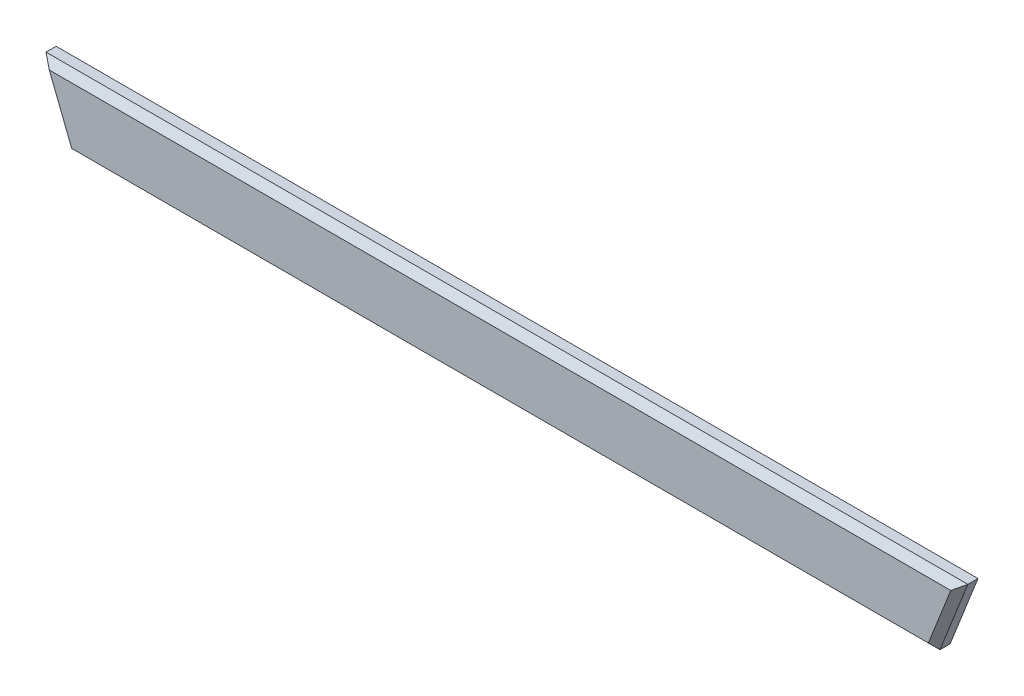
ISO-10303-21;
HEADER;
FILE_DESCRIPTION(('STEP AP214'),'2;1');
FILE_NAME('part.step','',(''),(''),'','','');
FILE_SCHEMA(('AUTOMOTIVE_DESIGN { 1 0 10303 214 1 1 1 1 }'));
ENDSEC;
DATA;
#1=APPLICATION_CONTEXT('core data for automotive mechanical design processes');
#2=APPLICATION_PROTOCOL_DEFINITION('international standard','automotive_design',2000,#1);
#3=PRODUCT_CONTEXT('',#1,'mechanical');
#4=PRODUCT('Part','Part','',(#3));
#5=PRODUCT_RELATED_PRODUCT_CATEGORY('part','',(#4));
#6=PRODUCT_DEFINITION_FORMATION('','',#4);
#7=PRODUCT_DEFINITION_CONTEXT('part definition',#1,'design');
#8=PRODUCT_DEFINITION('design','',#6,#7);
#9=PRODUCT_DEFINITION_SHAPE('','',#8);
#10=(LENGTH_UNIT() NAMED_UNIT(*) SI_UNIT(.MILLI.,.METRE.));
#11=(NAMED_UNIT(*) PLANE_ANGLE_UNIT() SI_UNIT($,.RADIAN.));
#12=(NAMED_UNIT(*) SI_UNIT($,.STERADIAN.) SOLID_ANGLE_UNIT());
#13=UNCERTAINTY_MEASURE_WITH_UNIT(LENGTH_MEASURE(1.E-05),#10,'distance_accuracy_value','');
#14=(GEOMETRIC_REPRESENTATION_CONTEXT(3) GLOBAL_UNCERTAINTY_ASSIGNED_CONTEXT((#13)) GLOBAL_UNIT_ASSIGNED_CONTEXT((#10,
#11,#12)) REPRESENTATION_CONTEXT('',''));
#15=CARTESIAN_POINT('',(0.,0.,0.));
#16=DIRECTION('',(0.,0.,1.));
#17=DIRECTION('',(1.,0.,0.));
#18=AXIS2_PLACEMENT_3D('',#15,#16,#17);
#19=CARTESIAN_POINT('',(0.,0.,0.));
#20=DIRECTION('',(0.,0.,-1.));
#21=DIRECTION('',(-1.,0.,0.));
#22=AXIS2_PLACEMENT_3D('',#19,#20,#21);
#23=PLANE('',#22);
#24=CARTESIAN_POINT('',(-0.259574213234581,1.00607340425443,0.));
#25=DIRECTION('',(0.,0.,-1.));
#26=DIRECTION('',(-1.,0.,0.));
#27=AXIS2_PLACEMENT_3D('',#24,#25,#26);
#28=CIRCLE('',#27,3.);
#29=CARTESIAN_POINT('',(-3.25957421323458,1.00607340425443,0.));
#30=VERTEX_POINT('',#29);
#31=EDGE_CURVE('E192',#30,#30,#28,.T.);
#32=ORIENTED_EDGE('',*,*,#31,.F.);
#33=EDGE_LOOP('',(#32));
#34=FACE_BOUND('',#33,.T.);
#35=DIRECTION('',(0.367438410264357,-0.930047856114083,0.));
#36=VECTOR('',#35,1.);
#37=CARTESIAN_POINT('',(-100.,7.89372984240581,0.));
#38=LINE('',#37,#36);
#39=CARTESIAN_POINT('',(-100.,7.89372984240581,0.));
#40=VERTEX_POINT('',#39);
#41=CARTESIAN_POINT('',(-93.9514058075983,-7.41627015759419,0.));
#42=VERTEX_POINT('',#41);
#43=EDGE_CURVE('E89',#40,#42,#38,.T.);
#44=ORIENTED_EDGE('',*,*,#43,.F.);
#45=DIRECTION('',(-1.,0.,0.));
#46=VECTOR('',#45,1.);
#47=CARTESIAN_POINT('',(100.,7.89372984240583,0.));
#48=LINE('',#47,#46);
#49=CARTESIAN_POINT('',(100.,7.89372984240583,0.));
#50=VERTEX_POINT('',#49);
#51=EDGE_CURVE('E94',#50,#40,#48,.T.);
#52=ORIENTED_EDGE('',*,*,#51,.F.);
#53=DIRECTION('',(0.367438410264355,0.930047856114084,0.));
#54=VECTOR('',#53,1.);
#55=CARTESIAN_POINT('',(100.,7.89372984240583,0.));
#56=LINE('',#55,#54);
#57=CARTESIAN_POINT('',(93.9514058075983,-7.41627015759417,0.));
#58=VERTEX_POINT('',#57);
#59=EDGE_CURVE('E115',#58,#50,#56,.T.);
#60=ORIENTED_EDGE('',*,*,#59,.F.);
#61=DIRECTION('',(1.,0.,0.));
#62=VECTOR('',#61,1.);
#63=CARTESIAN_POINT('',(93.9514058075983,-7.41627015759417,0.));
#64=LINE('',#63,#62);
#65=EDGE_CURVE('E106',#42,#58,#64,.T.);
#66=ORIENTED_EDGE('',*,*,#65,.F.);
#67=EDGE_LOOP('',(#44,#52,#60,#66));
#68=FACE_BOUND('',#67,.T.);
#69=CARTESIAN_POINT('',(69.7404257867654,1.00607340425443,0.));
#70=DIRECTION('',(0.,0.,-1.));
#71=DIRECTION('',(-1.,0.,0.));
#72=AXIS2_PLACEMENT_3D('',#69,#70,#71);
#73=CIRCLE('',#72,3.00000000000001);
#74=CARTESIAN_POINT('',(66.7404257867654,1.00607340425443,0.));
#75=VERTEX_POINT('',#74);
#76=EDGE_CURVE('E186',#75,#75,#73,.T.);
#77=ORIENTED_EDGE('',*,*,#76,.F.);
#78=EDGE_LOOP('',(#77));
#79=FACE_BOUND('',#78,.T.);
#80=CARTESIAN_POINT('',(-70.2595742132346,1.00607340425443,0.));
#81=DIRECTION('',(0.,0.,-1.));
#82=DIRECTION('',(-1.,0.,0.));
#83=AXIS2_PLACEMENT_3D('',#80,#81,#82);
#84=CIRCLE('',#83,3.00000000000001);
#85=CARTESIAN_POINT('',(-73.2595742132346,1.00607340425443,0.));
#86=VERTEX_POINT('',#85);
#87=EDGE_CURVE('E198',#86,#86,#84,.T.);
#88=ORIENTED_EDGE('',*,*,#87,.F.);
#89=EDGE_LOOP('',(#88));
#90=FACE_BOUND('',#89,.T.);
#91=ADVANCED_FACE('F33',(#34,#68,#79,#90),#23,.T.);
#92=CARTESIAN_POINT('',(-100.,7.89372984240581,204.285134294643));
#93=DIRECTION('',(0.930047856114083,0.367438410264357,0.));
#94=DIRECTION('',(-0.367438410264357,0.930047856114083,0.));
#95=AXIS2_PLACEMENT_3D('',#92,#93,#94);
#96=PLANE('',#95);
#97=DIRECTION('',(0.,0.,-1.));
#98=VECTOR('',#97,1.);
#99=CARTESIAN_POINT('',(-93.9514058075983,-7.41627015759419,204.285134294643));
#100=LINE('',#99,#98);
#101=CARTESIAN_POINT('',(-93.9514058075983,-7.41627015759419,2.19999999999976));
#102=VERTEX_POINT('',#101);
#103=EDGE_CURVE('E107',#102,#42,#100,.T.);
#104=ORIENTED_EDGE('',*,*,#103,.F.);
#105=DIRECTION('',(-0.367438410264357,0.930047856114083,0.));
#106=VECTOR('',#105,1.);
#107=CARTESIAN_POINT('',(-100.,7.89372984240581,2.19999999999976));
#108=LINE('',#107,#106);
#109=CARTESIAN_POINT('',(-100.,7.89372984240581,2.19999999999976));
#110=VERTEX_POINT('',#109);
#111=EDGE_CURVE('E42',#102,#110,#108,.T.);
#112=ORIENTED_EDGE('',*,*,#111,.T.);
#113=DIRECTION('',(0.,0.,-1.));
#114=VECTOR('',#113,1.);
#115=CARTESIAN_POINT('',(-100.,7.89372984240581,204.285134294643));
#116=LINE('',#115,#114);
#117=EDGE_CURVE('E85',#110,#40,#116,.T.);
#118=ORIENTED_EDGE('',*,*,#117,.T.);
#119=ORIENTED_EDGE('',*,*,#43,.T.);
#120=EDGE_LOOP('',(#104,#112,#118,#119));
#121=FACE_BOUND('',#120,.T.);
#122=ADVANCED_FACE('F87',(#121),#96,.F.);
#123=CARTESIAN_POINT('',(93.9514058075983,-7.41627015759417,204.285134294643));
#124=DIRECTION('',(0.,1.,0.));
#125=DIRECTION('',(-1.,0.,0.));
#126=AXIS2_PLACEMENT_3D('',#123,#124,#125);
#127=PLANE('',#126);
#128=DIRECTION('',(0.,0.,-1.));
#129=VECTOR('',#128,1.);
#130=CARTESIAN_POINT('',(93.9514058075983,-7.41627015759417,204.285134294643));
#131=LINE('',#130,#129);
#132=CARTESIAN_POINT('',(93.9514058075983,-7.41627015759417,2.19999999999976));
#133=VERTEX_POINT('',#132);
#134=EDGE_CURVE('E113',#133,#58,#131,.T.);
#135=ORIENTED_EDGE('',*,*,#134,.F.);
#136=DIRECTION('',(-1.,0.,0.));
#137=VECTOR('',#136,1.);
#138=CARTESIAN_POINT('',(-93.9514058075983,-7.41627015759419,2.19999999999976));
#139=LINE('',#138,#137);
#140=EDGE_CURVE('E57',#133,#102,#139,.T.);
#141=ORIENTED_EDGE('',*,*,#140,.T.);
#142=ORIENTED_EDGE('',*,*,#103,.T.);
#143=ORIENTED_EDGE('',*,*,#65,.T.);
#144=EDGE_LOOP('',(#135,#141,#142,#143));
#145=FACE_BOUND('',#144,.T.);
#146=ADVANCED_FACE('F172',(#145),#127,.F.);
#147=CARTESIAN_POINT('',(100.,7.89372984240583,204.285134294643));
#148=DIRECTION('',(-0.930047856114084,0.367438410264355,0.));
#149=DIRECTION('',(-0.367438410264355,-0.930047856114084,0.));
#150=AXIS2_PLACEMENT_3D('',#147,#148,#149);
#151=PLANE('',#150);
#152=DIRECTION('',(0.,0.,-1.));
#153=VECTOR('',#152,1.);
#154=CARTESIAN_POINT('',(100.,7.89372984240583,204.285134294643));
#155=LINE('',#154,#153);
#156=CARTESIAN_POINT('',(100.,7.89372984240583,2.19999999999976));
#157=VERTEX_POINT('',#156);
#158=EDGE_CURVE('E97',#157,#50,#155,.T.);
#159=ORIENTED_EDGE('',*,*,#158,.F.);
#160=DIRECTION('',(-0.367438410264355,-0.930047856114084,0.));
#161=VECTOR('',#160,1.);
#162=CARTESIAN_POINT('',(93.9514058075983,-7.41627015759417,2.19999999999975));
#163=LINE('',#162,#161);
#164=EDGE_CURVE('E125',#157,#133,#163,.T.);
#165=ORIENTED_EDGE('',*,*,#164,.T.);
#166=ORIENTED_EDGE('',*,*,#134,.T.);
#167=ORIENTED_EDGE('',*,*,#59,.T.);
#168=EDGE_LOOP('',(#159,#165,#166,#167));
#169=FACE_BOUND('',#168,.T.);
#170=ADVANCED_FACE('F151',(#169),#151,.F.);
#171=CARTESIAN_POINT('',(100.,7.89372984240583,204.285134294643));
#172=DIRECTION('',(0.,-1.,0.));
#173=DIRECTION('',(1.,0.,0.));
#174=AXIS2_PLACEMENT_3D('',#171,#172,#173);
#175=PLANE('',#174);
#176=ORIENTED_EDGE('',*,*,#117,.F.);
#177=DIRECTION('',(1.,0.,0.));
#178=VECTOR('',#177,1.);
#179=CARTESIAN_POINT('',(100.,7.89372984240583,2.19999999999976));
#180=LINE('',#179,#178);
#181=EDGE_CURVE('E11',#110,#157,#180,.T.);
#182=ORIENTED_EDGE('',*,*,#181,.T.);
#183=ORIENTED_EDGE('',*,*,#158,.T.);
#184=ORIENTED_EDGE('',*,*,#51,.T.);
#185=EDGE_LOOP('',(#176,#182,#183,#184));
#186=FACE_BOUND('',#185,.T.);
#187=ADVANCED_FACE('F95',(#186),#175,.F.);
#188=CARTESIAN_POINT('',(-348.259574213234,-90.2870035949879,3.69999999999973));
#189=DIRECTION('',(0.,0.,1.));
#190=DIRECTION('',(1.,0.,0.));
#191=AXIS2_PLACEMENT_3D('',#188,#189,#190);
#192=PLANE('',#191);
#193=DIRECTION('',(1.,0.,0.));
#194=VECTOR('',#193,1.);
#195=CARTESIAN_POINT('',(93.9514058075983,-5.91627015759418,3.69999999999973));
#196=LINE('',#195,#194);
#197=CARTESIAN_POINT('',(-92.9311976770534,-5.91627015759421,3.69999999999973));
#198=VERTEX_POINT('',#197);
#199=CARTESIAN_POINT('',(92.9311976770535,-5.91627015759418,3.69999999999973));
#200=VERTEX_POINT('',#199);
#201=EDGE_CURVE('E120',#198,#200,#196,.T.);
#202=ORIENTED_EDGE('',*,*,#201,.T.);
#203=DIRECTION('',(0.367438410264355,0.930047856114084,0.));
#204=VECTOR('',#203,1.);
#205=CARTESIAN_POINT('',(98.604928215829,8.44488745780233,3.69999999999973));
#206=LINE('',#205,#204);
#207=CARTESIAN_POINT('',(97.7945676645431,6.39372984240586,3.69999999999973));
#208=VERTEX_POINT('',#207);
#209=EDGE_CURVE('E122',#200,#208,#206,.T.);
#210=ORIENTED_EDGE('',*,*,#209,.T.);
#211=DIRECTION('',(-1.,0.,0.));
#212=VECTOR('',#211,1.);
#213=CARTESIAN_POINT('',(-100.,6.39372984240583,3.69999999999973));
#214=LINE('',#213,#212);
#215=CARTESIAN_POINT('',(-97.794567664543,6.39372984240583,3.69999999999973));
#216=VERTEX_POINT('',#215);
#217=EDGE_CURVE('E101',#208,#216,#214,.T.);
#218=ORIENTED_EDGE('',*,*,#217,.T.);
#219=DIRECTION('',(0.367438410264357,-0.930047856114083,0.));
#220=VECTOR('',#219,1.);
#221=CARTESIAN_POINT('',(-92.5563340234272,-6.86511254219767,3.69999999999973));
#222=LINE('',#221,#220);
#223=EDGE_CURVE('E118',#216,#198,#222,.T.);
#224=ORIENTED_EDGE('',*,*,#223,.T.);
#225=EDGE_LOOP('',(#202,#210,#218,#224));
#226=FACE_BOUND('',#225,.T.);
#227=ADVANCED_FACE('F156',(#226),#192,.T.);
#228=CARTESIAN_POINT('',(-98.570874992776,8.35869307471827,3.69999999999973));
#229=DIRECTION('',(-0.657643145886281,-0.259818191566332,0.707106781186545));
#230=DIRECTION('',(-0.367438410264357,0.930047856114083,0.));
#231=AXIS2_PLACEMENT_3D('',#228,#229,#230);
#232=PLANE('',#231);
#233=DIRECTION('',(0.720716752701175,-0.490187393950453,0.490187393950453));
#234=VECTOR('',#233,1.);
#235=CARTESIAN_POINT('',(-227.894266648674,94.8795769657782,-84.7858471233726));
#236=LINE('',#235,#234);
#237=EDGE_CURVE('E134',#110,#216,#236,.T.);
#238=ORIENTED_EDGE('',*,*,#237,.F.);
#239=ORIENTED_EDGE('',*,*,#111,.F.);
#240=DIRECTION('',(0.433412645070103,0.637241508022407,0.637241508022402));
#241=VECTOR('',#240,1.);
#242=CARTESIAN_POINT('',(-90.0480103640216,-1.67715380470086,7.93911635289304));
#243=LINE('',#242,#241);
#244=EDGE_CURVE('E37',#198,#102,#243,.F.);
#245=ORIENTED_EDGE('',*,*,#244,.F.);
#246=ORIENTED_EDGE('',*,*,#223,.F.);
#247=EDGE_LOOP('',(#238,#239,#245,#246));
#248=FACE_BOUND('',#247,.T.);
#249=ADVANCED_FACE('F35',(#248),#232,.T.);
#250=CARTESIAN_POINT('',(-348.259574213234,-5.91627015759424,3.69999999999973));
#251=DIRECTION('',(0.,-0.707106781186545,0.70710678118655));
#252=DIRECTION('',(-1.,0.,0.));
#253=AXIS2_PLACEMENT_3D('',#250,#251,#252);
#254=PLANE('',#253);
#255=ORIENTED_EDGE('',*,*,#244,.T.);
#256=ORIENTED_EDGE('',*,*,#140,.F.);
#257=DIRECTION('',(-0.433412645070077,0.637241508022416,0.637241508022411));
#258=VECTOR('',#257,1.);
#259=CARTESIAN_POINT('',(10.0550461213478,115.935559495214,125.551829652807));
#260=LINE('',#259,#258);
#261=EDGE_CURVE('E132',#200,#133,#260,.F.);
#262=ORIENTED_EDGE('',*,*,#261,.F.);
#263=ORIENTED_EDGE('',*,*,#201,.F.);
#264=EDGE_LOOP('',(#255,#256,#262,#263));
#265=FACE_BOUND('',#264,.T.);
#266=ADVANCED_FACE('F143',(#265),#254,.T.);
#267=CARTESIAN_POINT('',(-348.259574213234,6.3937298424058,3.69999999999973));
#268=DIRECTION('',(0.,0.707106781186548,0.707106781186548));
#269=DIRECTION('',(1.,0.,0.));
#270=AXIS2_PLACEMENT_3D('',#267,#268,#269);
#271=PLANE('',#270);
#272=ORIENTED_EDGE('',*,*,#237,.T.);
#273=ORIENTED_EDGE('',*,*,#217,.F.);
#274=DIRECTION('',(0.720716752701162,0.490187393950462,-0.490187393950462));
#275=VECTOR('',#274,1.);
#276=CARTESIAN_POINT('',(-133.900511774189,-151.191072724699,161.284802567104));
#277=LINE('',#276,#275);
#278=EDGE_CURVE('E130',#157,#208,#277,.F.);
#279=ORIENTED_EDGE('',*,*,#278,.F.);
#280=ORIENTED_EDGE('',*,*,#181,.F.);
#281=EDGE_LOOP('',(#272,#273,#279,#280));
#282=FACE_BOUND('',#281,.T.);
#283=ADVANCED_FACE('F148',(#282),#271,.T.);
#284=CARTESIAN_POINT('',(4.53313845721459,-229.666491052866,3.69999999999973));
#285=DIRECTION('',(0.657643145886297,-0.259818191566338,0.707106781186528));
#286=DIRECTION('',(-0.367438410264355,-0.930047856114084,0.));
#287=AXIS2_PLACEMENT_3D('',#284,#285,#286);
#288=PLANE('',#287);
#289=ORIENTED_EDGE('',*,*,#261,.T.);
#290=ORIENTED_EDGE('',*,*,#164,.F.);
#291=ORIENTED_EDGE('',*,*,#278,.T.);
#292=ORIENTED_EDGE('',*,*,#209,.F.);
#293=EDGE_LOOP('',(#289,#290,#291,#292));
#294=FACE_BOUND('',#293,.T.);
#295=ADVANCED_FACE('F153',(#294),#288,.T.);
#296=CARTESIAN_POINT('',(69.7404257867654,1.00607340425443,0.));
#297=DIRECTION('',(0.,0.,1.));
#298=DIRECTION('',(-1.,0.,0.));
#299=AXIS2_PLACEMENT_3D('',#296,#297,#298);
#300=CONICAL_SURFACE('',#299,3.00000000000001,0.174532925199433);
#301=CARTESIAN_POINT('',(69.7404257867654,1.00607340425443,-3.));
#302=DIRECTION('',(0.,0.,-1.));
#303=DIRECTION('',(-1.,0.,0.));
#304=AXIS2_PLACEMENT_3D('',#301,#302,#303);
#305=CIRCLE('',#304,2.47101905787461);
#306=CARTESIAN_POINT('',(67.2694067288908,1.00607340425443,-3.));
#307=VERTEX_POINT('',#306);
#308=EDGE_CURVE('E133',#307,#307,#305,.T.);
#309=ORIENTED_EDGE('',*,*,#308,.F.);
#310=EDGE_LOOP('',(#309));
#311=FACE_BOUND('',#310,.T.);
#312=ORIENTED_EDGE('',*,*,#76,.T.);
#313=EDGE_LOOP('',(#312));
#314=FACE_BOUND('',#313,.T.);
#315=ADVANCED_FACE('F175',(#311,#314),#300,.T.);
#316=CARTESIAN_POINT('',(69.7404257867654,1.00607340425443,-3.));
#317=DIRECTION('',(0.,0.,-1.));
#318=DIRECTION('',(-1.,0.,0.));
#319=AXIS2_PLACEMENT_3D('',#316,#317,#318);
#320=PLANE('',#319);
#321=ORIENTED_EDGE('',*,*,#308,.T.);
#322=EDGE_LOOP('',(#321));
#323=FACE_BOUND('',#322,.T.);
#324=ADVANCED_FACE('F221',(#323),#320,.T.);
#325=CARTESIAN_POINT('',(-0.259574213234581,1.00607340425443,0.));
#326=DIRECTION('',(0.,0.,1.));
#327=DIRECTION('',(-1.,0.,0.));
#328=AXIS2_PLACEMENT_3D('',#325,#326,#327);
#329=CONICAL_SURFACE('',#328,3.,0.174532925199433);
#330=CARTESIAN_POINT('',(-0.259574213234581,1.00607340425443,-3.));
#331=DIRECTION('',(0.,0.,-1.));
#332=DIRECTION('',(-1.,0.,0.));
#333=AXIS2_PLACEMENT_3D('',#330,#331,#332);
#334=CIRCLE('',#333,2.47101905787461);
#335=CARTESIAN_POINT('',(-2.73059327110919,1.00607340425443,-3.));
#336=VERTEX_POINT('',#335);
#337=EDGE_CURVE('E189',#336,#336,#334,.T.);
#338=ORIENTED_EDGE('',*,*,#337,.F.);
#339=EDGE_LOOP('',(#338));
#340=FACE_BOUND('',#339,.T.);
#341=ORIENTED_EDGE('',*,*,#31,.T.);
#342=EDGE_LOOP('',(#341));
#343=FACE_BOUND('',#342,.T.);
#344=ADVANCED_FACE('F215',(#340,#343),#329,.T.);
#345=CARTESIAN_POINT('',(-0.259574213234581,1.00607340425443,-3.));
#346=DIRECTION('',(0.,0.,-1.));
#347=DIRECTION('',(-1.,0.,0.));
#348=AXIS2_PLACEMENT_3D('',#345,#346,#347);
#349=PLANE('',#348);
#350=ORIENTED_EDGE('',*,*,#337,.T.);
#351=EDGE_LOOP('',(#350));
#352=FACE_BOUND('',#351,.T.);
#353=ADVANCED_FACE('F206',(#352),#349,.T.);
#354=CARTESIAN_POINT('',(-70.2595742132346,1.00607340425443,0.));
#355=DIRECTION('',(0.,0.,1.));
#356=DIRECTION('',(-1.,0.,0.));
#357=AXIS2_PLACEMENT_3D('',#354,#355,#356);
#358=CONICAL_SURFACE('',#357,3.00000000000001,0.174532925199433);
#359=CARTESIAN_POINT('',(-70.2595742132346,1.00607340425443,-3.));
#360=DIRECTION('',(0.,0.,-1.));
#361=DIRECTION('',(-1.,0.,0.));
#362=AXIS2_PLACEMENT_3D('',#359,#360,#361);
#363=CIRCLE('',#362,2.47101905787461);
#364=CARTESIAN_POINT('',(-72.7305932711092,1.00607340425443,-3.));
#365=VERTEX_POINT('',#364);
#366=EDGE_CURVE('E195',#365,#365,#363,.T.);
#367=ORIENTED_EDGE('',*,*,#366,.F.);
#368=EDGE_LOOP('',(#367));
#369=FACE_BOUND('',#368,.T.);
#370=ORIENTED_EDGE('',*,*,#87,.T.);
#371=EDGE_LOOP('',(#370));
#372=FACE_BOUND('',#371,.T.);
#373=ADVANCED_FACE('F202',(#369,#372),#358,.T.);
#374=CARTESIAN_POINT('',(-70.2595742132346,1.00607340425443,-3.));
#375=DIRECTION('',(0.,0.,-1.));
#376=DIRECTION('',(-1.,0.,0.));
#377=AXIS2_PLACEMENT_3D('',#374,#375,#376);
#378=PLANE('',#377);
#379=ORIENTED_EDGE('',*,*,#366,.T.);
#380=EDGE_LOOP('',(#379));
#381=FACE_BOUND('',#380,.T.);
#382=ADVANCED_FACE('F205',(#381),#378,.T.);
#383=CLOSED_SHELL('',(#91,#122,#146,#170,#187,#227,#249,#266,#283,#295,#315,#324,#344,#353,#373,#382));
#384=MANIFOLD_SOLID_BREP('B2',#383);
#385=ADVANCED_BREP_SHAPE_REPRESENTATION('',(#18,#384),#14);
#386=SHAPE_DEFINITION_REPRESENTATION(#9,#385);
ENDSEC;
END-ISO-10303-21;
